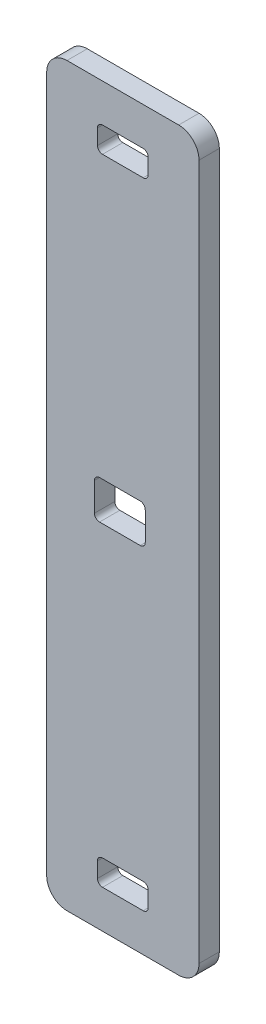
ISO-10303-21;
HEADER;
FILE_DESCRIPTION(('STEP AP214'),'2;1');
FILE_NAME('part.step','',(''),(''),'','','');
FILE_SCHEMA(('AUTOMOTIVE_DESIGN { 1 0 10303 214 1 1 1 1 }'));
ENDSEC;
DATA;
#1=APPLICATION_CONTEXT('core data for automotive mechanical design processes');
#2=APPLICATION_PROTOCOL_DEFINITION('international standard','automotive_design',2000,#1);
#3=PRODUCT_CONTEXT('',#1,'mechanical');
#4=PRODUCT('Part','Part','',(#3));
#5=PRODUCT_RELATED_PRODUCT_CATEGORY('part','',(#4));
#6=PRODUCT_DEFINITION_FORMATION('','',#4);
#7=PRODUCT_DEFINITION_CONTEXT('part definition',#1,'design');
#8=PRODUCT_DEFINITION('design','',#6,#7);
#9=PRODUCT_DEFINITION_SHAPE('','',#8);
#10=(LENGTH_UNIT() NAMED_UNIT(*) SI_UNIT(.MILLI.,.METRE.));
#11=(NAMED_UNIT(*) PLANE_ANGLE_UNIT() SI_UNIT($,.RADIAN.));
#12=(NAMED_UNIT(*) SI_UNIT($,.STERADIAN.) SOLID_ANGLE_UNIT());
#13=UNCERTAINTY_MEASURE_WITH_UNIT(LENGTH_MEASURE(1.E-05),#10,'distance_accuracy_value','');
#14=(GEOMETRIC_REPRESENTATION_CONTEXT(3) GLOBAL_UNCERTAINTY_ASSIGNED_CONTEXT((#13)) GLOBAL_UNIT_ASSIGNED_CONTEXT((#10,
#11,#12)) REPRESENTATION_CONTEXT('',''));
#15=CARTESIAN_POINT('',(0.,0.,0.));
#16=DIRECTION('',(0.,0.,1.));
#17=DIRECTION('',(1.,0.,0.));
#18=AXIS2_PLACEMENT_3D('',#15,#16,#17);
#19=CARTESIAN_POINT('',(-11.,-68.5,4.));
#20=DIRECTION('',(0.,0.,-1.));
#21=DIRECTION('',(-1.,0.,0.));
#22=AXIS2_PLACEMENT_3D('',#19,#20,#21);
#23=CYLINDRICAL_SURFACE('',#22,4.);
#24=CARTESIAN_POINT('',(-11.,-68.5,0.));
#25=DIRECTION('',(0.,0.,1.));
#26=DIRECTION('',(-1.,0.,0.));
#27=AXIS2_PLACEMENT_3D('',#24,#25,#26);
#28=CIRCLE('',#27,4.);
#29=CARTESIAN_POINT('',(-15.,-68.5,0.));
#30=VERTEX_POINT('',#29);
#31=CARTESIAN_POINT('',(-11.,-72.5,0.));
#32=VERTEX_POINT('',#31);
#33=EDGE_CURVE('E304',#30,#32,#28,.T.);
#34=ORIENTED_EDGE('',*,*,#33,.T.);
#35=DIRECTION('',(0.,0.,-1.));
#36=VECTOR('',#35,1.);
#37=CARTESIAN_POINT('',(-11.,-72.5,4.));
#38=LINE('',#37,#36);
#39=CARTESIAN_POINT('',(-11.,-72.5,4.));
#40=VERTEX_POINT('',#39);
#41=EDGE_CURVE('E11',#40,#32,#38,.T.);
#42=ORIENTED_EDGE('',*,*,#41,.F.);
#43=CARTESIAN_POINT('',(-11.,-68.5,4.));
#44=DIRECTION('',(0.,0.,1.));
#45=DIRECTION('',(-1.,0.,0.));
#46=AXIS2_PLACEMENT_3D('',#43,#44,#45);
#47=CIRCLE('',#46,4.);
#48=CARTESIAN_POINT('',(-15.,-68.5,4.));
#49=VERTEX_POINT('',#48);
#50=EDGE_CURVE('E441',#49,#40,#47,.T.);
#51=ORIENTED_EDGE('',*,*,#50,.F.);
#52=DIRECTION('',(0.,0.,-1.));
#53=VECTOR('',#52,1.);
#54=CARTESIAN_POINT('',(-15.,-68.5,4.));
#55=LINE('',#54,#53);
#56=EDGE_CURVE('E459',#49,#30,#55,.T.);
#57=ORIENTED_EDGE('',*,*,#56,.T.);
#58=EDGE_LOOP('',(#34,#42,#51,#57));
#59=FACE_BOUND('',#58,.T.);
#60=ADVANCED_FACE('F35',(#59),#23,.T.);
#61=CARTESIAN_POINT('',(-11.,-72.5,4.));
#62=DIRECTION('',(0.,1.,0.));
#63=DIRECTION('',(0.,0.,1.));
#64=AXIS2_PLACEMENT_3D('',#61,#62,#63);
#65=PLANE('',#64);
#66=DIRECTION('',(1.,0.,0.));
#67=VECTOR('',#66,1.);
#68=CARTESIAN_POINT('',(-11.,-72.5,0.));
#69=LINE('',#68,#67);
#70=CARTESIAN_POINT('',(11.,-72.5,0.));
#71=VERTEX_POINT('',#70);
#72=EDGE_CURVE('E462',#32,#71,#69,.T.);
#73=ORIENTED_EDGE('',*,*,#72,.T.);
#74=DIRECTION('',(0.,0.,-1.));
#75=VECTOR('',#74,1.);
#76=CARTESIAN_POINT('',(11.,-72.5,4.));
#77=LINE('',#76,#75);
#78=CARTESIAN_POINT('',(11.,-72.5,4.));
#79=VERTEX_POINT('',#78);
#80=EDGE_CURVE('E42',#79,#71,#77,.T.);
#81=ORIENTED_EDGE('',*,*,#80,.F.);
#82=DIRECTION('',(1.,0.,0.));
#83=VECTOR('',#82,1.);
#84=CARTESIAN_POINT('',(-11.,-72.5,4.));
#85=LINE('',#84,#83);
#86=EDGE_CURVE('E444',#40,#79,#85,.T.);
#87=ORIENTED_EDGE('',*,*,#86,.F.);
#88=ORIENTED_EDGE('',*,*,#41,.T.);
#89=EDGE_LOOP('',(#73,#81,#87,#88));
#90=FACE_BOUND('',#89,.T.);
#91=ADVANCED_FACE('F518',(#90),#65,.F.);
#92=CARTESIAN_POINT('',(11.,-68.5,4.));
#93=DIRECTION('',(0.,0.,-1.));
#94=DIRECTION('',(-1.,0.,0.));
#95=AXIS2_PLACEMENT_3D('',#92,#93,#94);
#96=CYLINDRICAL_SURFACE('',#95,4.);
#97=CARTESIAN_POINT('',(11.,-68.5,0.));
#98=DIRECTION('',(0.,0.,1.));
#99=DIRECTION('',(1.,0.,0.));
#100=AXIS2_PLACEMENT_3D('',#97,#98,#99);
#101=CIRCLE('',#100,4.);
#102=CARTESIAN_POINT('',(15.,-68.5,0.));
#103=VERTEX_POINT('',#102);
#104=EDGE_CURVE('E464',#71,#103,#101,.T.);
#105=ORIENTED_EDGE('',*,*,#104,.T.);
#106=DIRECTION('',(0.,0.,-1.));
#107=VECTOR('',#106,1.);
#108=CARTESIAN_POINT('',(15.,-68.5,4.));
#109=LINE('',#108,#107);
#110=CARTESIAN_POINT('',(15.,-68.5,4.));
#111=VERTEX_POINT('',#110);
#112=EDGE_CURVE('E489',#111,#103,#109,.T.);
#113=ORIENTED_EDGE('',*,*,#112,.F.);
#114=CARTESIAN_POINT('',(11.,-68.5,4.));
#115=DIRECTION('',(0.,0.,1.));
#116=DIRECTION('',(1.,0.,0.));
#117=AXIS2_PLACEMENT_3D('',#114,#115,#116);
#118=CIRCLE('',#117,4.);
#119=EDGE_CURVE('E447',#79,#111,#118,.T.);
#120=ORIENTED_EDGE('',*,*,#119,.F.);
#121=ORIENTED_EDGE('',*,*,#80,.T.);
#122=EDGE_LOOP('',(#105,#113,#120,#121));
#123=FACE_BOUND('',#122,.T.);
#124=ADVANCED_FACE('F496',(#123),#96,.T.);
#125=CARTESIAN_POINT('',(15.,-68.5,4.));
#126=DIRECTION('',(-1.,0.,0.));
#127=DIRECTION('',(0.,0.,1.));
#128=AXIS2_PLACEMENT_3D('',#125,#126,#127);
#129=PLANE('',#128);
#130=DIRECTION('',(0.,1.,0.));
#131=VECTOR('',#130,1.);
#132=CARTESIAN_POINT('',(15.,-68.5,0.));
#133=LINE('',#132,#131);
#134=CARTESIAN_POINT('',(15.,68.5,0.));
#135=VERTEX_POINT('',#134);
#136=EDGE_CURVE('E466',#103,#135,#133,.T.);
#137=ORIENTED_EDGE('',*,*,#136,.T.);
#138=DIRECTION('',(0.,0.,-1.));
#139=VECTOR('',#138,1.);
#140=CARTESIAN_POINT('',(15.,68.5,4.));
#141=LINE('',#140,#139);
#142=CARTESIAN_POINT('',(15.,68.5,4.));
#143=VERTEX_POINT('',#142);
#144=EDGE_CURVE('E486',#143,#135,#141,.T.);
#145=ORIENTED_EDGE('',*,*,#144,.F.);
#146=DIRECTION('',(0.,1.,0.));
#147=VECTOR('',#146,1.);
#148=CARTESIAN_POINT('',(15.,-68.5,4.));
#149=LINE('',#148,#147);
#150=EDGE_CURVE('E449',#111,#143,#149,.T.);
#151=ORIENTED_EDGE('',*,*,#150,.F.);
#152=ORIENTED_EDGE('',*,*,#112,.T.);
#153=EDGE_LOOP('',(#137,#145,#151,#152));
#154=FACE_BOUND('',#153,.T.);
#155=ADVANCED_FACE('F506',(#154),#129,.F.);
#156=CARTESIAN_POINT('',(11.,68.5,4.));
#157=DIRECTION('',(0.,0.,-1.));
#158=DIRECTION('',(-1.,0.,0.));
#159=AXIS2_PLACEMENT_3D('',#156,#157,#158);
#160=CYLINDRICAL_SURFACE('',#159,4.);
#161=CARTESIAN_POINT('',(11.,68.5,0.));
#162=DIRECTION('',(0.,0.,1.));
#163=DIRECTION('',(-1.,0.,0.));
#164=AXIS2_PLACEMENT_3D('',#161,#162,#163);
#165=CIRCLE('',#164,4.);
#166=CARTESIAN_POINT('',(11.,72.5,0.));
#167=VERTEX_POINT('',#166);
#168=EDGE_CURVE('E468',#135,#167,#165,.T.);
#169=ORIENTED_EDGE('',*,*,#168,.T.);
#170=DIRECTION('',(0.,0.,-1.));
#171=VECTOR('',#170,1.);
#172=CARTESIAN_POINT('',(11.,72.5,4.));
#173=LINE('',#172,#171);
#174=CARTESIAN_POINT('',(11.,72.5,4.));
#175=VERTEX_POINT('',#174);
#176=EDGE_CURVE('E483',#175,#167,#173,.T.);
#177=ORIENTED_EDGE('',*,*,#176,.F.);
#178=CARTESIAN_POINT('',(11.,68.5,4.));
#179=DIRECTION('',(0.,0.,1.));
#180=DIRECTION('',(-1.,0.,0.));
#181=AXIS2_PLACEMENT_3D('',#178,#179,#180);
#182=CIRCLE('',#181,4.);
#183=EDGE_CURVE('E451',#143,#175,#182,.T.);
#184=ORIENTED_EDGE('',*,*,#183,.F.);
#185=ORIENTED_EDGE('',*,*,#144,.T.);
#186=EDGE_LOOP('',(#169,#177,#184,#185));
#187=FACE_BOUND('',#186,.T.);
#188=ADVANCED_FACE('F510',(#187),#160,.T.);
#189=CARTESIAN_POINT('',(-11.,72.5,4.));
#190=DIRECTION('',(0.,-1.,0.));
#191=DIRECTION('',(0.,0.,-1.));
#192=AXIS2_PLACEMENT_3D('',#189,#190,#191);
#193=PLANE('',#192);
#194=DIRECTION('',(-1.,0.,0.));
#195=VECTOR('',#194,1.);
#196=CARTESIAN_POINT('',(-11.,72.5,0.));
#197=LINE('',#196,#195);
#198=CARTESIAN_POINT('',(-11.,72.5,0.));
#199=VERTEX_POINT('',#198);
#200=EDGE_CURVE('E470',#167,#199,#197,.T.);
#201=ORIENTED_EDGE('',*,*,#200,.T.);
#202=DIRECTION('',(0.,0.,-1.));
#203=VECTOR('',#202,1.);
#204=CARTESIAN_POINT('',(-11.,72.5,4.));
#205=LINE('',#204,#203);
#206=CARTESIAN_POINT('',(-11.,72.5,4.));
#207=VERTEX_POINT('',#206);
#208=EDGE_CURVE('E480',#207,#199,#205,.T.);
#209=ORIENTED_EDGE('',*,*,#208,.F.);
#210=DIRECTION('',(-1.,0.,0.));
#211=VECTOR('',#210,1.);
#212=CARTESIAN_POINT('',(-11.,72.5,4.));
#213=LINE('',#212,#211);
#214=EDGE_CURVE('E453',#175,#207,#213,.T.);
#215=ORIENTED_EDGE('',*,*,#214,.F.);
#216=ORIENTED_EDGE('',*,*,#176,.T.);
#217=EDGE_LOOP('',(#201,#209,#215,#216));
#218=FACE_BOUND('',#217,.T.);
#219=ADVANCED_FACE('F531',(#218),#193,.F.);
#220=CARTESIAN_POINT('',(-11.,68.5,4.));
#221=DIRECTION('',(0.,0.,-1.));
#222=DIRECTION('',(-1.,0.,0.));
#223=AXIS2_PLACEMENT_3D('',#220,#221,#222);
#224=CYLINDRICAL_SURFACE('',#223,4.);
#225=CARTESIAN_POINT('',(-11.,68.5,0.));
#226=DIRECTION('',(0.,0.,1.));
#227=DIRECTION('',(-1.,0.,0.));
#228=AXIS2_PLACEMENT_3D('',#225,#226,#227);
#229=CIRCLE('',#228,4.);
#230=CARTESIAN_POINT('',(-15.,68.5,0.));
#231=VERTEX_POINT('',#230);
#232=EDGE_CURVE('E472',#199,#231,#229,.T.);
#233=ORIENTED_EDGE('',*,*,#232,.T.);
#234=DIRECTION('',(0.,0.,-1.));
#235=VECTOR('',#234,1.);
#236=CARTESIAN_POINT('',(-15.,68.5,4.));
#237=LINE('',#236,#235);
#238=CARTESIAN_POINT('',(-15.,68.5,4.));
#239=VERTEX_POINT('',#238);
#240=EDGE_CURVE('E477',#239,#231,#237,.T.);
#241=ORIENTED_EDGE('',*,*,#240,.F.);
#242=CARTESIAN_POINT('',(-11.,68.5,4.));
#243=DIRECTION('',(0.,0.,1.));
#244=DIRECTION('',(-1.,0.,0.));
#245=AXIS2_PLACEMENT_3D('',#242,#243,#244);
#246=CIRCLE('',#245,4.);
#247=EDGE_CURVE('E455',#207,#239,#246,.T.);
#248=ORIENTED_EDGE('',*,*,#247,.F.);
#249=ORIENTED_EDGE('',*,*,#208,.T.);
#250=EDGE_LOOP('',(#233,#241,#248,#249));
#251=FACE_BOUND('',#250,.T.);
#252=ADVANCED_FACE('F529',(#251),#224,.T.);
#253=CARTESIAN_POINT('',(-15.,-68.5,4.));
#254=DIRECTION('',(1.,0.,0.));
#255=DIRECTION('',(0.,0.,-1.));
#256=AXIS2_PLACEMENT_3D('',#253,#254,#255);
#257=PLANE('',#256);
#258=DIRECTION('',(0.,-1.,0.));
#259=VECTOR('',#258,1.);
#260=CARTESIAN_POINT('',(-15.,-68.5,0.));
#261=LINE('',#260,#259);
#262=EDGE_CURVE('E445',#231,#30,#261,.T.);
#263=ORIENTED_EDGE('',*,*,#262,.T.);
#264=ORIENTED_EDGE('',*,*,#56,.F.);
#265=DIRECTION('',(0.,-1.,0.));
#266=VECTOR('',#265,1.);
#267=CARTESIAN_POINT('',(-15.,-68.5,4.));
#268=LINE('',#267,#266);
#269=EDGE_CURVE('E457',#239,#49,#268,.T.);
#270=ORIENTED_EDGE('',*,*,#269,.F.);
#271=ORIENTED_EDGE('',*,*,#240,.T.);
#272=EDGE_LOOP('',(#263,#264,#270,#271));
#273=FACE_BOUND('',#272,.T.);
#274=ADVANCED_FACE('F524',(#273),#257,.F.);
#275=CARTESIAN_POINT('',(-11.,-68.5,4.));
#276=DIRECTION('',(0.,0.,-1.));
#277=DIRECTION('',(-1.,0.,0.));
#278=AXIS2_PLACEMENT_3D('',#275,#276,#277);
#279=PLANE('',#278);
#280=DIRECTION('',(0.,-1.,0.));
#281=VECTOR('',#280,1.);
#282=CARTESIAN_POINT('',(-4.99999999999998,64.,4.));
#283=LINE('',#282,#281);
#284=CARTESIAN_POINT('',(-4.99999999999998,64.,4.));
#285=VERTEX_POINT('',#284);
#286=CARTESIAN_POINT('',(-4.99999999999998,61.,4.));
#287=VERTEX_POINT('',#286);
#288=EDGE_CURVE('E285',#285,#287,#283,.T.);
#289=ORIENTED_EDGE('',*,*,#288,.F.);
#290=CARTESIAN_POINT('',(-3.99999999999998,64.,4.));
#291=DIRECTION('',(0.,0.,1.));
#292=DIRECTION('',(1.,0.,0.));
#293=AXIS2_PLACEMENT_3D('',#290,#291,#292);
#294=CIRCLE('',#293,1.);
#295=CARTESIAN_POINT('',(-3.99999999999998,65.,4.));
#296=VERTEX_POINT('',#295);
#297=EDGE_CURVE('E49',#296,#285,#294,.T.);
#298=ORIENTED_EDGE('',*,*,#297,.F.);
#299=DIRECTION('',(-1.,0.,0.));
#300=VECTOR('',#299,1.);
#301=CARTESIAN_POINT('',(-3.99999999999998,65.,4.));
#302=LINE('',#301,#300);
#303=CARTESIAN_POINT('',(4.00000000000002,65.,4.));
#304=VERTEX_POINT('',#303);
#305=EDGE_CURVE('E265',#304,#296,#302,.T.);
#306=ORIENTED_EDGE('',*,*,#305,.F.);
#307=CARTESIAN_POINT('',(4.00000000000002,64.,4.));
#308=DIRECTION('',(0.,0.,1.));
#309=DIRECTION('',(-1.,0.,0.));
#310=AXIS2_PLACEMENT_3D('',#307,#308,#309);
#311=CIRCLE('',#310,1.);
#312=CARTESIAN_POINT('',(5.00000000000002,64.,4.));
#313=VERTEX_POINT('',#312);
#314=EDGE_CURVE('E268',#313,#304,#311,.T.);
#315=ORIENTED_EDGE('',*,*,#314,.F.);
#316=DIRECTION('',(0.,1.,0.));
#317=VECTOR('',#316,1.);
#318=CARTESIAN_POINT('',(5.00000000000002,64.,4.));
#319=LINE('',#318,#317);
#320=CARTESIAN_POINT('',(5.00000000000002,61.,4.));
#321=VERTEX_POINT('',#320);
#322=EDGE_CURVE('E297',#321,#313,#319,.T.);
#323=ORIENTED_EDGE('',*,*,#322,.F.);
#324=CARTESIAN_POINT('',(4.00000000000002,61.,4.));
#325=DIRECTION('',(0.,0.,1.));
#326=DIRECTION('',(1.,0.,0.));
#327=AXIS2_PLACEMENT_3D('',#324,#325,#326);
#328=CIRCLE('',#327,1.);
#329=CARTESIAN_POINT('',(4.00000000000002,60.,4.));
#330=VERTEX_POINT('',#329);
#331=EDGE_CURVE('E294',#330,#321,#328,.T.);
#332=ORIENTED_EDGE('',*,*,#331,.F.);
#333=DIRECTION('',(1.,0.,0.));
#334=VECTOR('',#333,1.);
#335=CARTESIAN_POINT('',(-3.99999999999998,60.,4.));
#336=LINE('',#335,#334);
#337=CARTESIAN_POINT('',(-3.99999999999998,60.,4.));
#338=VERTEX_POINT('',#337);
#339=EDGE_CURVE('E291',#338,#330,#336,.T.);
#340=ORIENTED_EDGE('',*,*,#339,.F.);
#341=CARTESIAN_POINT('',(-3.99999999999998,61.,4.));
#342=DIRECTION('',(0.,0.,1.));
#343=DIRECTION('',(1.,0.,0.));
#344=AXIS2_PLACEMENT_3D('',#341,#342,#343);
#345=CIRCLE('',#344,1.);
#346=EDGE_CURVE('E288',#287,#338,#345,.T.);
#347=ORIENTED_EDGE('',*,*,#346,.F.);
#348=EDGE_LOOP('',(#289,#298,#306,#315,#323,#332,#340,#347));
#349=FACE_BOUND('',#348,.T.);
#350=DIRECTION('',(0.,-1.,0.));
#351=VECTOR('',#350,1.);
#352=CARTESIAN_POINT('',(-5.00000000000003,-61.,4.));
#353=LINE('',#352,#351);
#354=CARTESIAN_POINT('',(-5.00000000000003,-61.,4.));
#355=VERTEX_POINT('',#354);
#356=CARTESIAN_POINT('',(-5.00000000000003,-64.,4.));
#357=VERTEX_POINT('',#356);
#358=EDGE_CURVE('E343',#355,#357,#353,.T.);
#359=ORIENTED_EDGE('',*,*,#358,.F.);
#360=CARTESIAN_POINT('',(-4.00000000000003,-61.,4.));
#361=DIRECTION('',(0.,0.,1.));
#362=DIRECTION('',(1.,0.,0.));
#363=AXIS2_PLACEMENT_3D('',#360,#361,#362);
#364=CIRCLE('',#363,1.);
#365=CARTESIAN_POINT('',(-4.00000000000003,-60.,4.));
#366=VERTEX_POINT('',#365);
#367=EDGE_CURVE('E57',#366,#355,#364,.T.);
#368=ORIENTED_EDGE('',*,*,#367,.F.);
#369=DIRECTION('',(-1.,0.,0.));
#370=VECTOR('',#369,1.);
#371=CARTESIAN_POINT('',(-4.00000000000003,-60.,4.));
#372=LINE('',#371,#370);
#373=CARTESIAN_POINT('',(3.99999999999997,-60.,4.));
#374=VERTEX_POINT('',#373);
#375=EDGE_CURVE('E320',#374,#366,#372,.T.);
#376=ORIENTED_EDGE('',*,*,#375,.F.);
#377=CARTESIAN_POINT('',(3.99999999999997,-61.,4.));
#378=DIRECTION('',(0.,0.,1.));
#379=DIRECTION('',(-1.,0.,0.));
#380=AXIS2_PLACEMENT_3D('',#377,#378,#379);
#381=CIRCLE('',#380,1.);
#382=CARTESIAN_POINT('',(4.99999999999997,-61.,4.));
#383=VERTEX_POINT('',#382);
#384=EDGE_CURVE('E359',#383,#374,#381,.T.);
#385=ORIENTED_EDGE('',*,*,#384,.F.);
#386=DIRECTION('',(0.,1.,0.));
#387=VECTOR('',#386,1.);
#388=CARTESIAN_POINT('',(4.99999999999997,-61.,4.));
#389=LINE('',#388,#387);
#390=CARTESIAN_POINT('',(4.99999999999997,-64.,4.));
#391=VERTEX_POINT('',#390);
#392=EDGE_CURVE('E356',#391,#383,#389,.T.);
#393=ORIENTED_EDGE('',*,*,#392,.F.);
#394=CARTESIAN_POINT('',(3.99999999999997,-64.,4.));
#395=DIRECTION('',(0.,0.,1.));
#396=DIRECTION('',(1.,0.,0.));
#397=AXIS2_PLACEMENT_3D('',#394,#395,#396);
#398=CIRCLE('',#397,1.);
#399=CARTESIAN_POINT('',(3.99999999999997,-65.,4.));
#400=VERTEX_POINT('',#399);
#401=EDGE_CURVE('E353',#400,#391,#398,.T.);
#402=ORIENTED_EDGE('',*,*,#401,.F.);
#403=DIRECTION('',(1.,0.,0.));
#404=VECTOR('',#403,1.);
#405=CARTESIAN_POINT('',(-4.00000000000003,-65.,4.));
#406=LINE('',#405,#404);
#407=CARTESIAN_POINT('',(-4.00000000000003,-65.,4.));
#408=VERTEX_POINT('',#407);
#409=EDGE_CURVE('E350',#408,#400,#406,.T.);
#410=ORIENTED_EDGE('',*,*,#409,.F.);
#411=CARTESIAN_POINT('',(-4.00000000000003,-64.,4.));
#412=DIRECTION('',(0.,0.,1.));
#413=DIRECTION('',(1.,0.,0.));
#414=AXIS2_PLACEMENT_3D('',#411,#412,#413);
#415=CIRCLE('',#414,1.);
#416=EDGE_CURVE('E347',#357,#408,#415,.T.);
#417=ORIENTED_EDGE('',*,*,#416,.F.);
#418=EDGE_LOOP('',(#359,#368,#376,#385,#393,#402,#410,#417));
#419=FACE_BOUND('',#418,.T.);
#420=DIRECTION('',(0.,-1.,0.));
#421=VECTOR('',#420,1.);
#422=CARTESIAN_POINT('',(-5.58762243909685,3.585,4.));
#423=LINE('',#422,#421);
#424=CARTESIAN_POINT('',(-5.58762243909685,3.58499999999999,4.));
#425=VERTEX_POINT('',#424);
#426=CARTESIAN_POINT('',(-5.58762243909685,-2.,4.));
#427=VERTEX_POINT('',#426);
#428=EDGE_CURVE('E406',#425,#427,#423,.T.);
#429=ORIENTED_EDGE('',*,*,#428,.F.);
#430=CARTESIAN_POINT('',(-4.58762243909685,3.585,4.));
#431=DIRECTION('',(0.,0.,1.));
#432=DIRECTION('',(1.,0.,0.));
#433=AXIS2_PLACEMENT_3D('',#430,#431,#432);
#434=CIRCLE('',#433,1.);
#435=CARTESIAN_POINT('',(-4.58762243909685,4.585,4.));
#436=VERTEX_POINT('',#435);
#437=EDGE_CURVE('E404',#436,#425,#434,.T.);
#438=ORIENTED_EDGE('',*,*,#437,.F.);
#439=DIRECTION('',(-1.,0.,0.));
#440=VECTOR('',#439,1.);
#441=CARTESIAN_POINT('',(-4.58762243909685,4.585,4.));
#442=LINE('',#441,#440);
#443=CARTESIAN_POINT('',(3.41237756090315,4.585,4.));
#444=VERTEX_POINT('',#443);
#445=EDGE_CURVE('E382',#444,#436,#442,.T.);
#446=ORIENTED_EDGE('',*,*,#445,.F.);
#447=CARTESIAN_POINT('',(3.41237756090315,3.585,4.));
#448=DIRECTION('',(0.,0.,1.));
#449=DIRECTION('',(-1.,0.,0.));
#450=AXIS2_PLACEMENT_3D('',#447,#448,#449);
#451=CIRCLE('',#450,1.);
#452=CARTESIAN_POINT('',(4.41237756090315,3.585,4.));
#453=VERTEX_POINT('',#452);
#454=EDGE_CURVE('E421',#453,#444,#451,.T.);
#455=ORIENTED_EDGE('',*,*,#454,.F.);
#456=DIRECTION('',(0.,1.,0.));
#457=VECTOR('',#456,1.);
#458=CARTESIAN_POINT('',(4.41237756090315,3.585,4.));
#459=LINE('',#458,#457);
#460=CARTESIAN_POINT('',(4.41237756090315,-2.,4.));
#461=VERTEX_POINT('',#460);
#462=EDGE_CURVE('E418',#461,#453,#459,.T.);
#463=ORIENTED_EDGE('',*,*,#462,.F.);
#464=CARTESIAN_POINT('',(3.41237756090315,-2.,4.));
#465=DIRECTION('',(0.,0.,1.));
#466=DIRECTION('',(1.,0.,0.));
#467=AXIS2_PLACEMENT_3D('',#464,#465,#466);
#468=CIRCLE('',#467,1.);
#469=CARTESIAN_POINT('',(3.41237756090315,-3.,4.));
#470=VERTEX_POINT('',#469);
#471=EDGE_CURVE('E415',#470,#461,#468,.T.);
#472=ORIENTED_EDGE('',*,*,#471,.F.);
#473=DIRECTION('',(1.,0.,0.));
#474=VECTOR('',#473,1.);
#475=CARTESIAN_POINT('',(-4.58762243909685,-3.,4.));
#476=LINE('',#475,#474);
#477=CARTESIAN_POINT('',(-4.58762243909685,-3.,4.));
#478=VERTEX_POINT('',#477);
#479=EDGE_CURVE('E412',#478,#470,#476,.T.);
#480=ORIENTED_EDGE('',*,*,#479,.F.);
#481=CARTESIAN_POINT('',(-4.58762243909685,-2.,4.));
#482=DIRECTION('',(0.,0.,1.));
#483=DIRECTION('',(1.,0.,0.));
#484=AXIS2_PLACEMENT_3D('',#481,#482,#483);
#485=CIRCLE('',#484,1.);
#486=EDGE_CURVE('E409',#427,#478,#485,.T.);
#487=ORIENTED_EDGE('',*,*,#486,.F.);
#488=EDGE_LOOP('',(#429,#438,#446,#455,#463,#472,#480,#487));
#489=FACE_BOUND('',#488,.T.);
#490=ORIENTED_EDGE('',*,*,#50,.T.);
#491=ORIENTED_EDGE('',*,*,#86,.T.);
#492=ORIENTED_EDGE('',*,*,#119,.T.);
#493=ORIENTED_EDGE('',*,*,#150,.T.);
#494=ORIENTED_EDGE('',*,*,#183,.T.);
#495=ORIENTED_EDGE('',*,*,#214,.T.);
#496=ORIENTED_EDGE('',*,*,#247,.T.);
#497=ORIENTED_EDGE('',*,*,#269,.T.);
#498=EDGE_LOOP('',(#490,#491,#492,#493,#494,#495,#496,#497));
#499=FACE_BOUND('',#498,.T.);
#500=ADVANCED_FACE('F514',(#349,#419,#489,#499),#279,.F.);
#501=CARTESIAN_POINT('',(-11.,-68.5,0.));
#502=DIRECTION('',(0.,0.,-1.));
#503=DIRECTION('',(-1.,0.,0.));
#504=AXIS2_PLACEMENT_3D('',#501,#502,#503);
#505=PLANE('',#504);
#506=CARTESIAN_POINT('',(-3.99999999999998,64.,0.));
#507=DIRECTION('',(0.,0.,1.));
#508=DIRECTION('',(1.,0.,0.));
#509=AXIS2_PLACEMENT_3D('',#506,#507,#508);
#510=CIRCLE('',#509,1.);
#511=CARTESIAN_POINT('',(-3.99999999999998,65.,0.));
#512=VERTEX_POINT('',#511);
#513=CARTESIAN_POINT('',(-4.99999999999998,64.,0.));
#514=VERTEX_POINT('',#513);
#515=EDGE_CURVE('E245',#512,#514,#510,.T.);
#516=ORIENTED_EDGE('',*,*,#515,.T.);
#517=DIRECTION('',(0.,-1.,0.));
#518=VECTOR('',#517,1.);
#519=CARTESIAN_POINT('',(-4.99999999999998,64.,0.));
#520=LINE('',#519,#518);
#521=CARTESIAN_POINT('',(-4.99999999999998,61.,0.));
#522=VERTEX_POINT('',#521);
#523=EDGE_CURVE('E255',#514,#522,#520,.T.);
#524=ORIENTED_EDGE('',*,*,#523,.T.);
#525=CARTESIAN_POINT('',(-3.99999999999998,61.,0.));
#526=DIRECTION('',(0.,0.,1.));
#527=DIRECTION('',(1.,0.,0.));
#528=AXIS2_PLACEMENT_3D('',#525,#526,#527);
#529=CIRCLE('',#528,1.);
#530=CARTESIAN_POINT('',(-3.99999999999998,60.,0.));
#531=VERTEX_POINT('',#530);
#532=EDGE_CURVE('E259',#522,#531,#529,.T.);
#533=ORIENTED_EDGE('',*,*,#532,.T.);
#534=DIRECTION('',(1.,0.,0.));
#535=VECTOR('',#534,1.);
#536=CARTESIAN_POINT('',(-3.99999999999998,60.,0.));
#537=LINE('',#536,#535);
#538=CARTESIAN_POINT('',(4.00000000000002,60.,0.));
#539=VERTEX_POINT('',#538);
#540=EDGE_CURVE('E272',#531,#539,#537,.T.);
#541=ORIENTED_EDGE('',*,*,#540,.T.);
#542=CARTESIAN_POINT('',(4.00000000000002,61.,0.));
#543=DIRECTION('',(0.,0.,1.));
#544=DIRECTION('',(1.,0.,0.));
#545=AXIS2_PLACEMENT_3D('',#542,#543,#544);
#546=CIRCLE('',#545,1.);
#547=CARTESIAN_POINT('',(5.00000000000002,61.,0.));
#548=VERTEX_POINT('',#547);
#549=EDGE_CURVE('E275',#539,#548,#546,.T.);
#550=ORIENTED_EDGE('',*,*,#549,.T.);
#551=DIRECTION('',(0.,1.,0.));
#552=VECTOR('',#551,1.);
#553=CARTESIAN_POINT('',(5.00000000000002,64.,0.));
#554=LINE('',#553,#552);
#555=CARTESIAN_POINT('',(5.00000000000002,64.,0.));
#556=VERTEX_POINT('',#555);
#557=EDGE_CURVE('E278',#548,#556,#554,.T.);
#558=ORIENTED_EDGE('',*,*,#557,.T.);
#559=CARTESIAN_POINT('',(4.00000000000002,64.,0.));
#560=DIRECTION('',(0.,0.,1.));
#561=DIRECTION('',(-1.,0.,0.));
#562=AXIS2_PLACEMENT_3D('',#559,#560,#561);
#563=CIRCLE('',#562,1.);
#564=CARTESIAN_POINT('',(4.00000000000002,65.,0.));
#565=VERTEX_POINT('',#564);
#566=EDGE_CURVE('E281',#556,#565,#563,.T.);
#567=ORIENTED_EDGE('',*,*,#566,.T.);
#568=DIRECTION('',(-1.,0.,0.));
#569=VECTOR('',#568,1.);
#570=CARTESIAN_POINT('',(-3.99999999999998,65.,0.));
#571=LINE('',#570,#569);
#572=EDGE_CURVE('E251',#565,#512,#571,.T.);
#573=ORIENTED_EDGE('',*,*,#572,.T.);
#574=EDGE_LOOP('',(#516,#524,#533,#541,#550,#558,#567,#573));
#575=FACE_BOUND('',#574,.T.);
#576=CARTESIAN_POINT('',(-4.00000000000003,-61.,0.));
#577=DIRECTION('',(0.,0.,1.));
#578=DIRECTION('',(1.,0.,0.));
#579=AXIS2_PLACEMENT_3D('',#576,#577,#578);
#580=CIRCLE('',#579,1.);
#581=CARTESIAN_POINT('',(-4.00000000000003,-60.,0.));
#582=VERTEX_POINT('',#581);
#583=CARTESIAN_POINT('',(-5.00000000000003,-61.,0.));
#584=VERTEX_POINT('',#583);
#585=EDGE_CURVE('E316',#582,#584,#580,.T.);
#586=ORIENTED_EDGE('',*,*,#585,.T.);
#587=DIRECTION('',(0.,-1.,0.));
#588=VECTOR('',#587,1.);
#589=CARTESIAN_POINT('',(-5.00000000000003,-61.,0.));
#590=LINE('',#589,#588);
#591=CARTESIAN_POINT('',(-5.00000000000003,-64.,0.));
#592=VERTEX_POINT('',#591);
#593=EDGE_CURVE('E319',#584,#592,#590,.T.);
#594=ORIENTED_EDGE('',*,*,#593,.T.);
#595=CARTESIAN_POINT('',(-4.00000000000003,-64.,0.));
#596=DIRECTION('',(0.,0.,1.));
#597=DIRECTION('',(1.,0.,0.));
#598=AXIS2_PLACEMENT_3D('',#595,#596,#597);
#599=CIRCLE('',#598,1.);
#600=CARTESIAN_POINT('',(-4.00000000000003,-65.,0.));
#601=VERTEX_POINT('',#600);
#602=EDGE_CURVE('E323',#592,#601,#599,.T.);
#603=ORIENTED_EDGE('',*,*,#602,.T.);
#604=DIRECTION('',(1.,0.,0.));
#605=VECTOR('',#604,1.);
#606=CARTESIAN_POINT('',(-4.00000000000003,-65.,0.));
#607=LINE('',#606,#605);
#608=CARTESIAN_POINT('',(3.99999999999997,-65.,0.));
#609=VERTEX_POINT('',#608);
#610=EDGE_CURVE('E326',#601,#609,#607,.T.);
#611=ORIENTED_EDGE('',*,*,#610,.T.);
#612=CARTESIAN_POINT('',(3.99999999999997,-64.,0.));
#613=DIRECTION('',(0.,0.,1.));
#614=DIRECTION('',(1.,0.,0.));
#615=AXIS2_PLACEMENT_3D('',#612,#613,#614);
#616=CIRCLE('',#615,1.);
#617=CARTESIAN_POINT('',(4.99999999999997,-64.,0.));
#618=VERTEX_POINT('',#617);
#619=EDGE_CURVE('E329',#609,#618,#616,.T.);
#620=ORIENTED_EDGE('',*,*,#619,.T.);
#621=DIRECTION('',(0.,1.,0.));
#622=VECTOR('',#621,1.);
#623=CARTESIAN_POINT('',(4.99999999999997,-61.,0.));
#624=LINE('',#623,#622);
#625=CARTESIAN_POINT('',(4.99999999999997,-61.,0.));
#626=VERTEX_POINT('',#625);
#627=EDGE_CURVE('E332',#618,#626,#624,.T.);
#628=ORIENTED_EDGE('',*,*,#627,.T.);
#629=CARTESIAN_POINT('',(3.99999999999997,-61.,0.));
#630=DIRECTION('',(0.,0.,1.));
#631=DIRECTION('',(-1.,0.,0.));
#632=AXIS2_PLACEMENT_3D('',#629,#630,#631);
#633=CIRCLE('',#632,1.);
#634=CARTESIAN_POINT('',(3.99999999999997,-60.,0.));
#635=VERTEX_POINT('',#634);
#636=EDGE_CURVE('E335',#626,#635,#633,.T.);
#637=ORIENTED_EDGE('',*,*,#636,.T.);
#638=DIRECTION('',(-1.,0.,0.));
#639=VECTOR('',#638,1.);
#640=CARTESIAN_POINT('',(-4.00000000000003,-60.,0.));
#641=LINE('',#640,#639);
#642=EDGE_CURVE('E338',#635,#582,#641,.T.);
#643=ORIENTED_EDGE('',*,*,#642,.T.);
#644=EDGE_LOOP('',(#586,#594,#603,#611,#620,#628,#637,#643));
#645=FACE_BOUND('',#644,.T.);
#646=CARTESIAN_POINT('',(-4.58762243909685,3.585,0.));
#647=DIRECTION('',(0.,0.,1.));
#648=DIRECTION('',(1.,0.,0.));
#649=AXIS2_PLACEMENT_3D('',#646,#647,#648);
#650=CIRCLE('',#649,1.);
#651=CARTESIAN_POINT('',(-4.58762243909685,4.585,0.));
#652=VERTEX_POINT('',#651);
#653=CARTESIAN_POINT('',(-5.58762243909685,3.585,0.));
#654=VERTEX_POINT('',#653);
#655=EDGE_CURVE('E378',#652,#654,#650,.T.);
#656=ORIENTED_EDGE('',*,*,#655,.T.);
#657=DIRECTION('',(0.,-1.,0.));
#658=VECTOR('',#657,1.);
#659=CARTESIAN_POINT('',(-5.58762243909685,3.585,0.));
#660=LINE('',#659,#658);
#661=CARTESIAN_POINT('',(-5.58762243909685,-2.,0.));
#662=VERTEX_POINT('',#661);
#663=EDGE_CURVE('E381',#654,#662,#660,.T.);
#664=ORIENTED_EDGE('',*,*,#663,.T.);
#665=CARTESIAN_POINT('',(-4.58762243909685,-2.,0.));
#666=DIRECTION('',(0.,0.,1.));
#667=DIRECTION('',(1.,0.,0.));
#668=AXIS2_PLACEMENT_3D('',#665,#666,#667);
#669=CIRCLE('',#668,1.);
#670=CARTESIAN_POINT('',(-4.58762243909685,-3.,0.));
#671=VERTEX_POINT('',#670);
#672=EDGE_CURVE('E385',#662,#671,#669,.T.);
#673=ORIENTED_EDGE('',*,*,#672,.T.);
#674=DIRECTION('',(1.,0.,0.));
#675=VECTOR('',#674,1.);
#676=CARTESIAN_POINT('',(-4.58762243909685,-3.,0.));
#677=LINE('',#676,#675);
#678=CARTESIAN_POINT('',(3.41237756090315,-3.,0.));
#679=VERTEX_POINT('',#678);
#680=EDGE_CURVE('E388',#671,#679,#677,.T.);
#681=ORIENTED_EDGE('',*,*,#680,.T.);
#682=CARTESIAN_POINT('',(3.41237756090315,-2.,0.));
#683=DIRECTION('',(0.,0.,1.));
#684=DIRECTION('',(1.,0.,0.));
#685=AXIS2_PLACEMENT_3D('',#682,#683,#684);
#686=CIRCLE('',#685,1.);
#687=CARTESIAN_POINT('',(4.41237756090315,-2.,0.));
#688=VERTEX_POINT('',#687);
#689=EDGE_CURVE('E391',#679,#688,#686,.T.);
#690=ORIENTED_EDGE('',*,*,#689,.T.);
#691=DIRECTION('',(0.,1.,0.));
#692=VECTOR('',#691,1.);
#693=CARTESIAN_POINT('',(4.41237756090315,3.585,0.));
#694=LINE('',#693,#692);
#695=CARTESIAN_POINT('',(4.41237756090315,3.585,0.));
#696=VERTEX_POINT('',#695);
#697=EDGE_CURVE('E394',#688,#696,#694,.T.);
#698=ORIENTED_EDGE('',*,*,#697,.T.);
#699=CARTESIAN_POINT('',(3.41237756090315,3.585,0.));
#700=DIRECTION('',(0.,0.,1.));
#701=DIRECTION('',(-1.,0.,0.));
#702=AXIS2_PLACEMENT_3D('',#699,#700,#701);
#703=CIRCLE('',#702,1.);
#704=CARTESIAN_POINT('',(3.41237756090315,4.585,0.));
#705=VERTEX_POINT('',#704);
#706=EDGE_CURVE('E397',#696,#705,#703,.T.);
#707=ORIENTED_EDGE('',*,*,#706,.T.);
#708=DIRECTION('',(-1.,0.,0.));
#709=VECTOR('',#708,1.);
#710=CARTESIAN_POINT('',(-4.58762243909685,4.585,0.));
#711=LINE('',#710,#709);
#712=EDGE_CURVE('E400',#705,#652,#711,.T.);
#713=ORIENTED_EDGE('',*,*,#712,.T.);
#714=EDGE_LOOP('',(#656,#664,#673,#681,#690,#698,#707,#713));
#715=FACE_BOUND('',#714,.T.);
#716=ORIENTED_EDGE('',*,*,#33,.F.);
#717=ORIENTED_EDGE('',*,*,#262,.F.);
#718=ORIENTED_EDGE('',*,*,#232,.F.);
#719=ORIENTED_EDGE('',*,*,#200,.F.);
#720=ORIENTED_EDGE('',*,*,#168,.F.);
#721=ORIENTED_EDGE('',*,*,#136,.F.);
#722=ORIENTED_EDGE('',*,*,#104,.F.);
#723=ORIENTED_EDGE('',*,*,#72,.F.);
#724=EDGE_LOOP('',(#716,#717,#718,#719,#720,#721,#722,#723));
#725=FACE_BOUND('',#724,.T.);
#726=ADVANCED_FACE('F261',(#575,#645,#715,#725),#505,.T.);
#727=CARTESIAN_POINT('',(-4.58762243909685,3.585,0.));
#728=DIRECTION('',(0.,0.,1.));
#729=DIRECTION('',(1.,0.,0.));
#730=AXIS2_PLACEMENT_3D('',#727,#728,#729);
#731=CYLINDRICAL_SURFACE('',#730,1.);
#732=ORIENTED_EDGE('',*,*,#437,.T.);
#733=DIRECTION('',(0.,0.,1.));
#734=VECTOR('',#733,1.);
#735=CARTESIAN_POINT('',(-5.58762243909685,3.585,0.));
#736=LINE('',#735,#734);
#737=EDGE_CURVE('E403',#654,#425,#736,.T.);
#738=ORIENTED_EDGE('',*,*,#737,.F.);
#739=ORIENTED_EDGE('',*,*,#655,.F.);
#740=DIRECTION('',(0.,0.,1.));
#741=VECTOR('',#740,1.);
#742=CARTESIAN_POINT('',(-4.58762243909685,4.585,0.));
#743=LINE('',#742,#741);
#744=EDGE_CURVE('E344',#652,#436,#743,.T.);
#745=ORIENTED_EDGE('',*,*,#744,.T.);
#746=EDGE_LOOP('',(#732,#738,#739,#745));
#747=FACE_BOUND('',#746,.T.);
#748=ADVANCED_FACE('F594',(#747),#731,.F.);
#749=CARTESIAN_POINT('',(-4.58762243909685,4.585,0.));
#750=DIRECTION('',(0.,1.,0.));
#751=DIRECTION('',(0.,0.,1.));
#752=AXIS2_PLACEMENT_3D('',#749,#750,#751);
#753=PLANE('',#752);
#754=ORIENTED_EDGE('',*,*,#445,.T.);
#755=ORIENTED_EDGE('',*,*,#744,.F.);
#756=ORIENTED_EDGE('',*,*,#712,.F.);
#757=DIRECTION('',(0.,0.,1.));
#758=VECTOR('',#757,1.);
#759=CARTESIAN_POINT('',(3.41237756090315,4.585,0.));
#760=LINE('',#759,#758);
#761=EDGE_CURVE('E427',#705,#444,#760,.T.);
#762=ORIENTED_EDGE('',*,*,#761,.T.);
#763=EDGE_LOOP('',(#754,#755,#756,#762));
#764=FACE_BOUND('',#763,.T.);
#765=ADVANCED_FACE('F603',(#764),#753,.F.);
#766=CARTESIAN_POINT('',(3.41237756090315,3.585,0.));
#767=DIRECTION('',(0.,0.,1.));
#768=DIRECTION('',(1.,0.,0.));
#769=AXIS2_PLACEMENT_3D('',#766,#767,#768);
#770=CYLINDRICAL_SURFACE('',#769,1.);
#771=ORIENTED_EDGE('',*,*,#454,.T.);
#772=ORIENTED_EDGE('',*,*,#761,.F.);
#773=ORIENTED_EDGE('',*,*,#706,.F.);
#774=DIRECTION('',(0.,0.,1.));
#775=VECTOR('',#774,1.);
#776=CARTESIAN_POINT('',(4.41237756090315,3.585,0.));
#777=LINE('',#776,#775);
#778=EDGE_CURVE('E429',#696,#453,#777,.T.);
#779=ORIENTED_EDGE('',*,*,#778,.T.);
#780=EDGE_LOOP('',(#771,#772,#773,#779));
#781=FACE_BOUND('',#780,.T.);
#782=ADVANCED_FACE('F613',(#781),#770,.F.);
#783=CARTESIAN_POINT('',(4.41237756090315,3.585,0.));
#784=DIRECTION('',(1.,0.,0.));
#785=DIRECTION('',(0.,1.,0.));
#786=AXIS2_PLACEMENT_3D('',#783,#784,#785);
#787=PLANE('',#786);
#788=ORIENTED_EDGE('',*,*,#462,.T.);
#789=ORIENTED_EDGE('',*,*,#778,.F.);
#790=ORIENTED_EDGE('',*,*,#697,.F.);
#791=DIRECTION('',(0.,0.,1.));
#792=VECTOR('',#791,1.);
#793=CARTESIAN_POINT('',(4.41237756090315,-2.,0.));
#794=LINE('',#793,#792);
#795=EDGE_CURVE('E431',#688,#461,#794,.T.);
#796=ORIENTED_EDGE('',*,*,#795,.T.);
#797=EDGE_LOOP('',(#788,#789,#790,#796));
#798=FACE_BOUND('',#797,.T.);
#799=ADVANCED_FACE('F623',(#798),#787,.F.);
#800=CARTESIAN_POINT('',(3.41237756090315,-2.,0.));
#801=DIRECTION('',(0.,0.,1.));
#802=DIRECTION('',(1.,0.,0.));
#803=AXIS2_PLACEMENT_3D('',#800,#801,#802);
#804=CYLINDRICAL_SURFACE('',#803,1.);
#805=ORIENTED_EDGE('',*,*,#471,.T.);
#806=ORIENTED_EDGE('',*,*,#795,.F.);
#807=ORIENTED_EDGE('',*,*,#689,.F.);
#808=DIRECTION('',(0.,0.,1.));
#809=VECTOR('',#808,1.);
#810=CARTESIAN_POINT('',(3.41237756090315,-3.,0.));
#811=LINE('',#810,#809);
#812=EDGE_CURVE('E433',#679,#470,#811,.T.);
#813=ORIENTED_EDGE('',*,*,#812,.T.);
#814=EDGE_LOOP('',(#805,#806,#807,#813));
#815=FACE_BOUND('',#814,.T.);
#816=ADVANCED_FACE('F633',(#815),#804,.F.);
#817=CARTESIAN_POINT('',(-4.58762243909685,-3.,0.));
#818=DIRECTION('',(0.,-1.,0.));
#819=DIRECTION('',(0.,0.,-1.));
#820=AXIS2_PLACEMENT_3D('',#817,#818,#819);
#821=PLANE('',#820);
#822=ORIENTED_EDGE('',*,*,#479,.T.);
#823=ORIENTED_EDGE('',*,*,#812,.F.);
#824=ORIENTED_EDGE('',*,*,#680,.F.);
#825=DIRECTION('',(0.,0.,1.));
#826=VECTOR('',#825,1.);
#827=CARTESIAN_POINT('',(-4.58762243909685,-3.,0.));
#828=LINE('',#827,#826);
#829=EDGE_CURVE('E435',#671,#478,#828,.T.);
#830=ORIENTED_EDGE('',*,*,#829,.T.);
#831=EDGE_LOOP('',(#822,#823,#824,#830));
#832=FACE_BOUND('',#831,.T.);
#833=ADVANCED_FACE('F643',(#832),#821,.F.);
#834=CARTESIAN_POINT('',(-4.58762243909685,-2.,0.));
#835=DIRECTION('',(0.,0.,1.));
#836=DIRECTION('',(1.,0.,0.));
#837=AXIS2_PLACEMENT_3D('',#834,#835,#836);
#838=CYLINDRICAL_SURFACE('',#837,1.);
#839=ORIENTED_EDGE('',*,*,#486,.T.);
#840=ORIENTED_EDGE('',*,*,#829,.F.);
#841=ORIENTED_EDGE('',*,*,#672,.F.);
#842=DIRECTION('',(0.,0.,1.));
#843=VECTOR('',#842,1.);
#844=CARTESIAN_POINT('',(-5.58762243909685,-2.,0.));
#845=LINE('',#844,#843);
#846=EDGE_CURVE('E437',#662,#427,#845,.T.);
#847=ORIENTED_EDGE('',*,*,#846,.T.);
#848=EDGE_LOOP('',(#839,#840,#841,#847));
#849=FACE_BOUND('',#848,.T.);
#850=ADVANCED_FACE('F653',(#849),#838,.F.);
#851=CARTESIAN_POINT('',(-5.58762243909685,3.585,0.));
#852=DIRECTION('',(-1.,0.,0.));
#853=DIRECTION('',(0.,-1.,0.));
#854=AXIS2_PLACEMENT_3D('',#851,#852,#853);
#855=PLANE('',#854);
#856=ORIENTED_EDGE('',*,*,#428,.T.);
#857=ORIENTED_EDGE('',*,*,#846,.F.);
#858=ORIENTED_EDGE('',*,*,#663,.F.);
#859=ORIENTED_EDGE('',*,*,#737,.T.);
#860=EDGE_LOOP('',(#856,#857,#858,#859));
#861=FACE_BOUND('',#860,.T.);
#862=ADVANCED_FACE('F663',(#861),#855,.F.);
#863=CARTESIAN_POINT('',(-4.00000000000003,-61.,0.));
#864=DIRECTION('',(0.,0.,1.));
#865=DIRECTION('',(1.,0.,0.));
#866=AXIS2_PLACEMENT_3D('',#863,#864,#865);
#867=CYLINDRICAL_SURFACE('',#866,1.);
#868=ORIENTED_EDGE('',*,*,#367,.T.);
#869=DIRECTION('',(0.,0.,1.));
#870=VECTOR('',#869,1.);
#871=CARTESIAN_POINT('',(-5.00000000000003,-61.,0.));
#872=LINE('',#871,#870);
#873=EDGE_CURVE('E341',#584,#355,#872,.T.);
#874=ORIENTED_EDGE('',*,*,#873,.F.);
#875=ORIENTED_EDGE('',*,*,#585,.F.);
#876=DIRECTION('',(0.,0.,1.));
#877=VECTOR('',#876,1.);
#878=CARTESIAN_POINT('',(-4.00000000000003,-60.,0.));
#879=LINE('',#878,#877);
#880=EDGE_CURVE('E286',#582,#366,#879,.T.);
#881=ORIENTED_EDGE('',*,*,#880,.T.);
#882=EDGE_LOOP('',(#868,#874,#875,#881));
#883=FACE_BOUND('',#882,.T.);
#884=ADVANCED_FACE('F673',(#883),#867,.F.);
#885=CARTESIAN_POINT('',(-4.00000000000003,-60.,0.));
#886=DIRECTION('',(0.,1.,0.));
#887=DIRECTION('',(0.,0.,1.));
#888=AXIS2_PLACEMENT_3D('',#885,#886,#887);
#889=PLANE('',#888);
#890=ORIENTED_EDGE('',*,*,#375,.T.);
#891=ORIENTED_EDGE('',*,*,#880,.F.);
#892=ORIENTED_EDGE('',*,*,#642,.F.);
#893=DIRECTION('',(0.,0.,1.));
#894=VECTOR('',#893,1.);
#895=CARTESIAN_POINT('',(3.99999999999997,-60.,0.));
#896=LINE('',#895,#894);
#897=EDGE_CURVE('E365',#635,#374,#896,.T.);
#898=ORIENTED_EDGE('',*,*,#897,.T.);
#899=EDGE_LOOP('',(#890,#891,#892,#898));
#900=FACE_BOUND('',#899,.T.);
#901=ADVANCED_FACE('F683',(#900),#889,.F.);
#902=CARTESIAN_POINT('',(3.99999999999997,-61.,0.));
#903=DIRECTION('',(0.,0.,1.));
#904=DIRECTION('',(1.,0.,0.));
#905=AXIS2_PLACEMENT_3D('',#902,#903,#904);
#906=CYLINDRICAL_SURFACE('',#905,1.);
#907=ORIENTED_EDGE('',*,*,#384,.T.);
#908=ORIENTED_EDGE('',*,*,#897,.F.);
#909=ORIENTED_EDGE('',*,*,#636,.F.);
#910=DIRECTION('',(0.,0.,1.));
#911=VECTOR('',#910,1.);
#912=CARTESIAN_POINT('',(4.99999999999997,-61.,0.));
#913=LINE('',#912,#911);
#914=EDGE_CURVE('E367',#626,#383,#913,.T.);
#915=ORIENTED_EDGE('',*,*,#914,.T.);
#916=EDGE_LOOP('',(#907,#908,#909,#915));
#917=FACE_BOUND('',#916,.T.);
#918=ADVANCED_FACE('F692',(#917),#906,.F.);
#919=CARTESIAN_POINT('',(4.99999999999997,-61.,0.));
#920=DIRECTION('',(1.,0.,0.));
#921=DIRECTION('',(0.,1.,0.));
#922=AXIS2_PLACEMENT_3D('',#919,#920,#921);
#923=PLANE('',#922);
#924=ORIENTED_EDGE('',*,*,#392,.T.);
#925=ORIENTED_EDGE('',*,*,#914,.F.);
#926=ORIENTED_EDGE('',*,*,#627,.F.);
#927=DIRECTION('',(0.,0.,1.));
#928=VECTOR('',#927,1.);
#929=CARTESIAN_POINT('',(4.99999999999997,-64.,0.));
#930=LINE('',#929,#928);
#931=EDGE_CURVE('E369',#618,#391,#930,.T.);
#932=ORIENTED_EDGE('',*,*,#931,.T.);
#933=EDGE_LOOP('',(#924,#925,#926,#932));
#934=FACE_BOUND('',#933,.T.);
#935=ADVANCED_FACE('F702',(#934),#923,.F.);
#936=CARTESIAN_POINT('',(3.99999999999997,-64.,0.));
#937=DIRECTION('',(0.,0.,1.));
#938=DIRECTION('',(1.,0.,0.));
#939=AXIS2_PLACEMENT_3D('',#936,#937,#938);
#940=CYLINDRICAL_SURFACE('',#939,1.);
#941=ORIENTED_EDGE('',*,*,#401,.T.);
#942=ORIENTED_EDGE('',*,*,#931,.F.);
#943=ORIENTED_EDGE('',*,*,#619,.F.);
#944=DIRECTION('',(0.,0.,1.));
#945=VECTOR('',#944,1.);
#946=CARTESIAN_POINT('',(3.99999999999997,-65.,0.));
#947=LINE('',#946,#945);
#948=EDGE_CURVE('E371',#609,#400,#947,.T.);
#949=ORIENTED_EDGE('',*,*,#948,.T.);
#950=EDGE_LOOP('',(#941,#942,#943,#949));
#951=FACE_BOUND('',#950,.T.);
#952=ADVANCED_FACE('F712',(#951),#940,.F.);
#953=CARTESIAN_POINT('',(-4.00000000000003,-65.,0.));
#954=DIRECTION('',(0.,-1.,0.));
#955=DIRECTION('',(0.,0.,-1.));
#956=AXIS2_PLACEMENT_3D('',#953,#954,#955);
#957=PLANE('',#956);
#958=ORIENTED_EDGE('',*,*,#409,.T.);
#959=ORIENTED_EDGE('',*,*,#948,.F.);
#960=ORIENTED_EDGE('',*,*,#610,.F.);
#961=DIRECTION('',(0.,0.,1.));
#962=VECTOR('',#961,1.);
#963=CARTESIAN_POINT('',(-4.00000000000003,-65.,0.));
#964=LINE('',#963,#962);
#965=EDGE_CURVE('E373',#601,#408,#964,.T.);
#966=ORIENTED_EDGE('',*,*,#965,.T.);
#967=EDGE_LOOP('',(#958,#959,#960,#966));
#968=FACE_BOUND('',#967,.T.);
#969=ADVANCED_FACE('F722',(#968),#957,.F.);
#970=CARTESIAN_POINT('',(-4.00000000000003,-64.,0.));
#971=DIRECTION('',(0.,0.,1.));
#972=DIRECTION('',(1.,0.,0.));
#973=AXIS2_PLACEMENT_3D('',#970,#971,#972);
#974=CYLINDRICAL_SURFACE('',#973,1.);
#975=ORIENTED_EDGE('',*,*,#416,.T.);
#976=ORIENTED_EDGE('',*,*,#965,.F.);
#977=ORIENTED_EDGE('',*,*,#602,.F.);
#978=DIRECTION('',(0.,0.,1.));
#979=VECTOR('',#978,1.);
#980=CARTESIAN_POINT('',(-5.00000000000003,-64.,0.));
#981=LINE('',#980,#979);
#982=EDGE_CURVE('E375',#592,#357,#981,.T.);
#983=ORIENTED_EDGE('',*,*,#982,.T.);
#984=EDGE_LOOP('',(#975,#976,#977,#983));
#985=FACE_BOUND('',#984,.T.);
#986=ADVANCED_FACE('F732',(#985),#974,.F.);
#987=CARTESIAN_POINT('',(-5.00000000000003,-61.,0.));
#988=DIRECTION('',(-1.,0.,0.));
#989=DIRECTION('',(0.,0.,1.));
#990=AXIS2_PLACEMENT_3D('',#987,#988,#989);
#991=PLANE('',#990);
#992=ORIENTED_EDGE('',*,*,#358,.T.);
#993=ORIENTED_EDGE('',*,*,#982,.F.);
#994=ORIENTED_EDGE('',*,*,#593,.F.);
#995=ORIENTED_EDGE('',*,*,#873,.T.);
#996=EDGE_LOOP('',(#992,#993,#994,#995));
#997=FACE_BOUND('',#996,.T.);
#998=ADVANCED_FACE('F742',(#997),#991,.F.);
#999=CARTESIAN_POINT('',(-3.99999999999998,64.,0.));
#1000=DIRECTION('',(0.,0.,1.));
#1001=DIRECTION('',(1.,0.,0.));
#1002=AXIS2_PLACEMENT_3D('',#999,#1000,#1001);
#1003=CYLINDRICAL_SURFACE('',#1002,1.);
#1004=ORIENTED_EDGE('',*,*,#297,.T.);
#1005=DIRECTION('',(0.,0.,1.));
#1006=VECTOR('',#1005,1.);
#1007=CARTESIAN_POINT('',(-4.99999999999998,64.,0.));
#1008=LINE('',#1007,#1006);
#1009=EDGE_CURVE('E241',#514,#285,#1008,.T.);
#1010=ORIENTED_EDGE('',*,*,#1009,.F.);
#1011=ORIENTED_EDGE('',*,*,#515,.F.);
#1012=DIRECTION('',(0.,0.,1.));
#1013=VECTOR('',#1012,1.);
#1014=CARTESIAN_POINT('',(-3.99999999999998,65.,0.));
#1015=LINE('',#1014,#1013);
#1016=EDGE_CURVE('E302',#512,#296,#1015,.T.);
#1017=ORIENTED_EDGE('',*,*,#1016,.T.);
#1018=EDGE_LOOP('',(#1004,#1010,#1011,#1017));
#1019=FACE_BOUND('',#1018,.T.);
#1020=ADVANCED_FACE('F243',(#1019),#1003,.F.);
#1021=CARTESIAN_POINT('',(-3.99999999999998,65.,0.));
#1022=DIRECTION('',(0.,1.,0.));
#1023=DIRECTION('',(0.,0.,1.));
#1024=AXIS2_PLACEMENT_3D('',#1021,#1022,#1023);
#1025=PLANE('',#1024);
#1026=ORIENTED_EDGE('',*,*,#305,.T.);
#1027=ORIENTED_EDGE('',*,*,#1016,.F.);
#1028=ORIENTED_EDGE('',*,*,#572,.F.);
#1029=DIRECTION('',(0.,0.,1.));
#1030=VECTOR('',#1029,1.);
#1031=CARTESIAN_POINT('',(4.00000000000002,65.,0.));
#1032=LINE('',#1031,#1030);
#1033=EDGE_CURVE('E305',#565,#304,#1032,.T.);
#1034=ORIENTED_EDGE('',*,*,#1033,.T.);
#1035=EDGE_LOOP('',(#1026,#1027,#1028,#1034));
#1036=FACE_BOUND('',#1035,.T.);
#1037=ADVANCED_FACE('F761',(#1036),#1025,.F.);
#1038=CARTESIAN_POINT('',(4.00000000000002,64.,0.));
#1039=DIRECTION('',(0.,0.,1.));
#1040=DIRECTION('',(1.,0.,0.));
#1041=AXIS2_PLACEMENT_3D('',#1038,#1039,#1040);
#1042=CYLINDRICAL_SURFACE('',#1041,1.);
#1043=ORIENTED_EDGE('',*,*,#314,.T.);
#1044=ORIENTED_EDGE('',*,*,#1033,.F.);
#1045=ORIENTED_EDGE('',*,*,#566,.F.);
#1046=DIRECTION('',(0.,0.,1.));
#1047=VECTOR('',#1046,1.);
#1048=CARTESIAN_POINT('',(5.00000000000002,64.,0.));
#1049=LINE('',#1048,#1047);
#1050=EDGE_CURVE('E307',#556,#313,#1049,.T.);
#1051=ORIENTED_EDGE('',*,*,#1050,.T.);
#1052=EDGE_LOOP('',(#1043,#1044,#1045,#1051));
#1053=FACE_BOUND('',#1052,.T.);
#1054=ADVANCED_FACE('F770',(#1053),#1042,.F.);
#1055=CARTESIAN_POINT('',(5.00000000000002,64.,0.));
#1056=DIRECTION('',(1.,0.,0.));
#1057=DIRECTION('',(0.,0.,-1.));
#1058=AXIS2_PLACEMENT_3D('',#1055,#1056,#1057);
#1059=PLANE('',#1058);
#1060=ORIENTED_EDGE('',*,*,#322,.T.);
#1061=ORIENTED_EDGE('',*,*,#1050,.F.);
#1062=ORIENTED_EDGE('',*,*,#557,.F.);
#1063=DIRECTION('',(0.,0.,1.));
#1064=VECTOR('',#1063,1.);
#1065=CARTESIAN_POINT('',(5.00000000000002,61.,0.));
#1066=LINE('',#1065,#1064);
#1067=EDGE_CURVE('E309',#548,#321,#1066,.T.);
#1068=ORIENTED_EDGE('',*,*,#1067,.T.);
#1069=EDGE_LOOP('',(#1060,#1061,#1062,#1068));
#1070=FACE_BOUND('',#1069,.T.);
#1071=ADVANCED_FACE('F780',(#1070),#1059,.F.);
#1072=CARTESIAN_POINT('',(4.00000000000002,61.,0.));
#1073=DIRECTION('',(0.,0.,1.));
#1074=DIRECTION('',(1.,0.,0.));
#1075=AXIS2_PLACEMENT_3D('',#1072,#1073,#1074);
#1076=CYLINDRICAL_SURFACE('',#1075,1.);
#1077=ORIENTED_EDGE('',*,*,#331,.T.);
#1078=ORIENTED_EDGE('',*,*,#1067,.F.);
#1079=ORIENTED_EDGE('',*,*,#549,.F.);
#1080=DIRECTION('',(0.,0.,1.));
#1081=VECTOR('',#1080,1.);
#1082=CARTESIAN_POINT('',(4.00000000000002,60.,0.));
#1083=LINE('',#1082,#1081);
#1084=EDGE_CURVE('E311',#539,#330,#1083,.T.);
#1085=ORIENTED_EDGE('',*,*,#1084,.T.);
#1086=EDGE_LOOP('',(#1077,#1078,#1079,#1085));
#1087=FACE_BOUND('',#1086,.T.);
#1088=ADVANCED_FACE('F790',(#1087),#1076,.F.);
#1089=CARTESIAN_POINT('',(-3.99999999999998,60.,0.));
#1090=DIRECTION('',(0.,-1.,0.));
#1091=DIRECTION('',(0.,0.,-1.));
#1092=AXIS2_PLACEMENT_3D('',#1089,#1090,#1091);
#1093=PLANE('',#1092);
#1094=ORIENTED_EDGE('',*,*,#339,.T.);
#1095=ORIENTED_EDGE('',*,*,#1084,.F.);
#1096=ORIENTED_EDGE('',*,*,#540,.F.);
#1097=DIRECTION('',(0.,0.,1.));
#1098=VECTOR('',#1097,1.);
#1099=CARTESIAN_POINT('',(-3.99999999999998,60.,0.));
#1100=LINE('',#1099,#1098);
#1101=EDGE_CURVE('E313',#531,#338,#1100,.T.);
#1102=ORIENTED_EDGE('',*,*,#1101,.T.);
#1103=EDGE_LOOP('',(#1094,#1095,#1096,#1102));
#1104=FACE_BOUND('',#1103,.T.);
#1105=ADVANCED_FACE('F800',(#1104),#1093,.F.);
#1106=CARTESIAN_POINT('',(-3.99999999999998,61.,0.));
#1107=DIRECTION('',(0.,0.,1.));
#1108=DIRECTION('',(1.,0.,0.));
#1109=AXIS2_PLACEMENT_3D('',#1106,#1107,#1108);
#1110=CYLINDRICAL_SURFACE('',#1109,1.);
#1111=ORIENTED_EDGE('',*,*,#346,.T.);
#1112=ORIENTED_EDGE('',*,*,#1101,.F.);
#1113=ORIENTED_EDGE('',*,*,#532,.F.);
#1114=DIRECTION('',(0.,0.,1.));
#1115=VECTOR('',#1114,1.);
#1116=CARTESIAN_POINT('',(-4.99999999999998,61.,0.));
#1117=LINE('',#1116,#1115);
#1118=EDGE_CURVE('E250',#522,#287,#1117,.T.);
#1119=ORIENTED_EDGE('',*,*,#1118,.T.);
#1120=EDGE_LOOP('',(#1111,#1112,#1113,#1119));
#1121=FACE_BOUND('',#1120,.T.);
#1122=ADVANCED_FACE('F810',(#1121),#1110,.F.);
#1123=CARTESIAN_POINT('',(-4.99999999999998,64.,0.));
#1124=DIRECTION('',(-1.,0.,0.));
#1125=DIRECTION('',(0.,-1.,0.));
#1126=AXIS2_PLACEMENT_3D('',#1123,#1124,#1125);
#1127=PLANE('',#1126);
#1128=ORIENTED_EDGE('',*,*,#288,.T.);
#1129=ORIENTED_EDGE('',*,*,#1118,.F.);
#1130=ORIENTED_EDGE('',*,*,#523,.F.);
#1131=ORIENTED_EDGE('',*,*,#1009,.T.);
#1132=EDGE_LOOP('',(#1128,#1129,#1130,#1131));
#1133=FACE_BOUND('',#1132,.T.);
#1134=ADVANCED_FACE('F256',(#1133),#1127,.F.);
#1135=CLOSED_SHELL('',(#60,#91,#124,#155,#188,#219,#252,#274,#500,#726,#748,#765,#782,#799,#816,
#833,#850,#862,#884,#901,#918,#935,#952,#969,#986,#998,#1020,#1037,#1054,#1071,#1088,#1105,
#1122,#1134));
#1136=MANIFOLD_SOLID_BREP('B2',#1135);
#1137=ADVANCED_BREP_SHAPE_REPRESENTATION('',(#18,#1136),#14);
#1138=SHAPE_DEFINITION_REPRESENTATION(#9,#1137);
ENDSEC;
END-ISO-10303-21;
